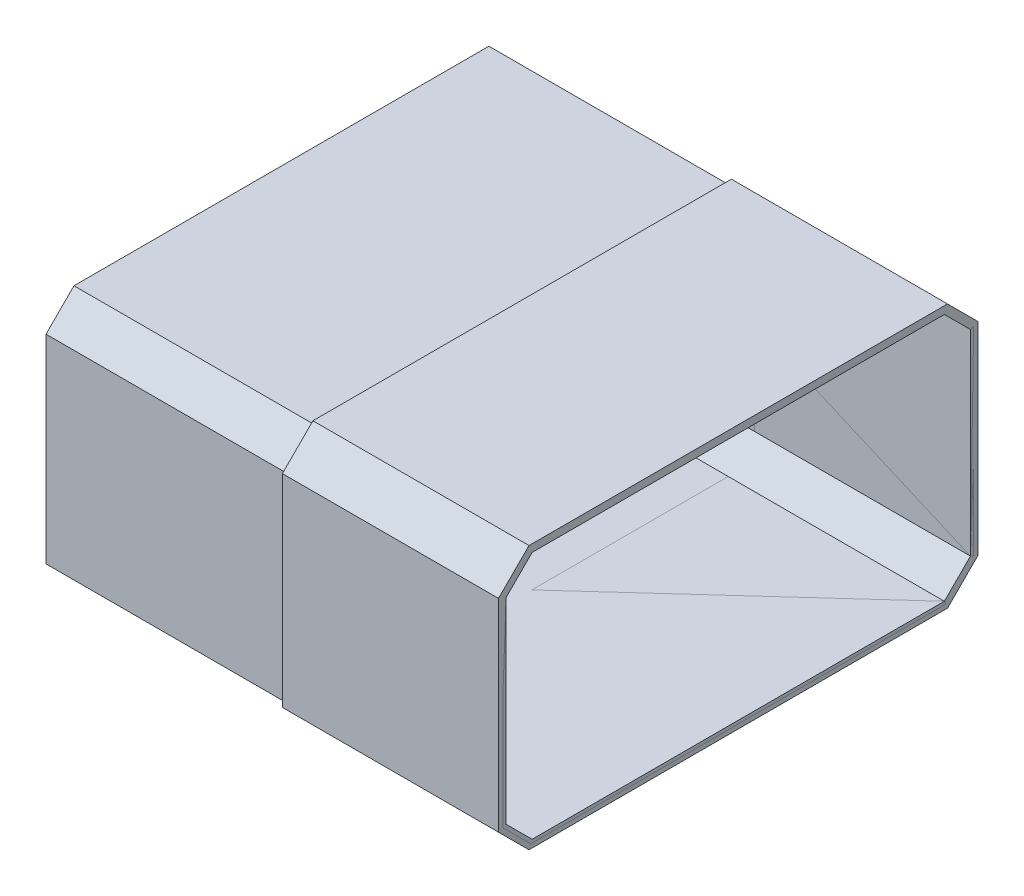
ISO-10303-21;
HEADER;
FILE_DESCRIPTION(('STEP AP214'),'2;1');
FILE_NAME('part.step','',(''),(''),'','','');
FILE_SCHEMA(('AUTOMOTIVE_DESIGN { 1 0 10303 214 1 1 1 1 }'));
ENDSEC;
DATA;
#1=APPLICATION_CONTEXT('core data for automotive mechanical design processes');
#2=APPLICATION_PROTOCOL_DEFINITION('international standard','automotive_design',2000,#1);
#3=PRODUCT_CONTEXT('',#1,'mechanical');
#4=PRODUCT('Part','Part','',(#3));
#5=PRODUCT_RELATED_PRODUCT_CATEGORY('part','',(#4));
#6=PRODUCT_DEFINITION_FORMATION('','',#4);
#7=PRODUCT_DEFINITION_CONTEXT('part definition',#1,'design');
#8=PRODUCT_DEFINITION('design','',#6,#7);
#9=PRODUCT_DEFINITION_SHAPE('','',#8);
#10=(LENGTH_UNIT() NAMED_UNIT(*) SI_UNIT(.MILLI.,.METRE.));
#11=(NAMED_UNIT(*) PLANE_ANGLE_UNIT() SI_UNIT($,.RADIAN.));
#12=(NAMED_UNIT(*) SI_UNIT($,.STERADIAN.) SOLID_ANGLE_UNIT());
#13=UNCERTAINTY_MEASURE_WITH_UNIT(LENGTH_MEASURE(1.E-05),#10,'distance_accuracy_value','');
#14=(GEOMETRIC_REPRESENTATION_CONTEXT(3) GLOBAL_UNCERTAINTY_ASSIGNED_CONTEXT((#13)) GLOBAL_UNIT_ASSIGNED_CONTEXT((#10,
#11,#12)) REPRESENTATION_CONTEXT('',''));
#15=CARTESIAN_POINT('',(0.,0.,0.));
#16=DIRECTION('',(0.,0.,1.));
#17=DIRECTION('',(1.,0.,0.));
#18=AXIS2_PLACEMENT_3D('',#15,#16,#17);
#19=CARTESIAN_POINT('',(190.275415021332,49.592810510066,-235.800889889658));
#20=DIRECTION('',(0.,1.,0.));
#21=DIRECTION('',(1.,0.,0.));
#22=AXIS2_PLACEMENT_3D('',#19,#20,#21);
#23=PLANE('',#22);
#24=DIRECTION('',(0.,0.,-1.));
#25=VECTOR('',#24,1.);
#26=CARTESIAN_POINT('',(395.275415021332,49.592810510066,-123.300889889658));
#27=LINE('',#26,#25);
#28=CARTESIAN_POINT('',(395.275415021332,49.592810510066,-44.943025513389));
#29=VERTEX_POINT('',#28);
#30=CARTESIAN_POINT('',(395.275415021332,49.592810510066,-426.658754265927));
#31=VERTEX_POINT('',#30);
#32=EDGE_CURVE('E259',#29,#31,#27,.T.);
#33=ORIENTED_EDGE('',*,*,#32,.T.);
#34=DIRECTION('',(1.,0.,0.));
#35=VECTOR('',#34,1.);
#36=CARTESIAN_POINT('',(77.775415021332,49.592810510066,-426.658754265927));
#37=LINE('',#36,#35);
#38=CARTESIAN_POINT('',(-24.724584978668,49.592810510066,-426.658754265927));
#39=VERTEX_POINT('',#38);
#40=EDGE_CURVE('E291',#39,#31,#37,.T.);
#41=ORIENTED_EDGE('',*,*,#40,.F.);
#42=DIRECTION('',(0.,0.,1.));
#43=VECTOR('',#42,1.);
#44=CARTESIAN_POINT('',(-24.724584978668,49.592810510066,-348.300889889658));
#45=LINE('',#44,#43);
#46=CARTESIAN_POINT('',(-24.724584978668,49.592810510066,-44.9430255133889));
#47=VERTEX_POINT('',#46);
#48=EDGE_CURVE('E12',#39,#47,#45,.T.);
#49=ORIENTED_EDGE('',*,*,#48,.T.);
#50=DIRECTION('',(-1.,0.,0.));
#51=VECTOR('',#50,1.);
#52=CARTESIAN_POINT('',(77.775415021332,49.592810510066,-44.9430255133889));
#53=LINE('',#52,#51);
#54=EDGE_CURVE('E347',#29,#47,#53,.T.);
#55=ORIENTED_EDGE('',*,*,#54,.F.);
#56=EDGE_LOOP('',(#33,#41,#49,#55));
#57=FACE_BOUND('',#56,.T.);
#58=ADVANCED_FACE('F48',(#57),#23,.T.);
#59=CARTESIAN_POINT('',(-24.724584978668,39.592810510066,-460.800889889658));
#60=DIRECTION('',(-1.,0.,0.));
#61=DIRECTION('',(0.,0.,1.));
#62=AXIS2_PLACEMENT_3D('',#59,#60,#61);
#63=PLANE('',#62);
#64=DIRECTION('',(0.,-0.707106781186548,0.707106781186548));
#65=VECTOR('',#64,1.);
#66=CARTESIAN_POINT('',(-24.724584978668,69.1638783219315,-446.229822077792));
#67=LINE('',#66,#65);
#68=CARTESIAN_POINT('',(-24.724584978668,73.7349461337969,-450.800889889658));
#69=VERTEX_POINT('',#68);
#70=EDGE_CURVE('E288',#69,#39,#67,.T.);
#71=ORIENTED_EDGE('',*,*,#70,.F.);
#72=DIRECTION('',(0.,1.,0.));
#73=VECTOR('',#72,1.);
#74=CARTESIAN_POINT('',(-24.724584978668,39.592810510066,-450.800889889658));
#75=LINE('',#74,#73);
#76=CARTESIAN_POINT('',(-24.724584978668,255.450674886335,-450.800889889658));
#77=VERTEX_POINT('',#76);
#78=EDGE_CURVE('E589',#69,#77,#75,.T.);
#79=ORIENTED_EDGE('',*,*,#78,.T.);
#80=DIRECTION('',(0.,-0.707106781186548,-0.707106781186548));
#81=VECTOR('',#80,1.);
#82=CARTESIAN_POINT('',(-24.724584978668,212.521742698201,-493.729822077792));
#83=LINE('',#82,#81);
#84=CARTESIAN_POINT('',(-24.724584978668,279.592810510066,-426.658754265927));
#85=VERTEX_POINT('',#84);
#86=EDGE_CURVE('E150',#85,#77,#83,.T.);
#87=ORIENTED_EDGE('',*,*,#86,.F.);
#88=DIRECTION('',(0.,0.,1.));
#89=VECTOR('',#88,1.);
#90=CARTESIAN_POINT('',(-24.724584978668,279.592810510066,-348.300889889658));
#91=LINE('',#90,#89);
#92=CARTESIAN_POINT('',(-24.724584978668,279.592810510066,-44.9430255133889));
#93=VERTEX_POINT('',#92);
#94=EDGE_CURVE('E264',#85,#93,#91,.T.);
#95=ORIENTED_EDGE('',*,*,#94,.T.);
#96=DIRECTION('',(0.,0.707106781186548,-0.707106781186548));
#97=VECTOR('',#96,1.);
#98=CARTESIAN_POINT('',(-24.724584978668,310.021742698201,-75.3719577015234));
#99=LINE('',#98,#97);
#100=CARTESIAN_POINT('',(-24.724584978668,255.450674886335,-20.800889889658));
#101=VERTEX_POINT('',#100);
#102=EDGE_CURVE('E273',#101,#93,#99,.T.);
#103=ORIENTED_EDGE('',*,*,#102,.F.);
#104=DIRECTION('',(0.,1.,0.));
#105=VECTOR('',#104,1.);
#106=CARTESIAN_POINT('',(-24.724584978668,39.592810510066,-20.800889889658));
#107=LINE('',#106,#105);
#108=CARTESIAN_POINT('',(-24.724584978668,73.7349461337969,-20.800889889658));
#109=VERTEX_POINT('',#108);
#110=EDGE_CURVE('E58',#109,#101,#107,.T.);
#111=ORIENTED_EDGE('',*,*,#110,.F.);
#112=DIRECTION('',(0.,0.707106781186548,0.707106781186548));
#113=VECTOR('',#112,1.);
#114=CARTESIAN_POINT('',(-24.724584978668,-58.3361216780685,-152.871957701523));
#115=LINE('',#114,#113);
#116=EDGE_CURVE('E344',#47,#109,#115,.T.);
#117=ORIENTED_EDGE('',*,*,#116,.F.);
#118=ORIENTED_EDGE('',*,*,#48,.F.);
#119=EDGE_LOOP('',(#71,#79,#87,#95,#103,#111,#117,#118));
#120=FACE_BOUND('',#119,.T.);
#121=ADVANCED_FACE('F386',(#120),#63,.F.);
#122=CARTESIAN_POINT('',(-34.724584978668,39.592810510066,-20.800889889658));
#123=DIRECTION('',(0.,0.,1.));
#124=DIRECTION('',(1.,0.,0.));
#125=AXIS2_PLACEMENT_3D('',#122,#123,#124);
#126=PLANE('',#125);
#127=DIRECTION('',(0.,-1.,0.));
#128=VECTOR('',#127,1.);
#129=CARTESIAN_POINT('',(395.275415021332,39.592810510066,-20.800889889658));
#130=LINE('',#129,#128);
#131=CARTESIAN_POINT('',(395.275415021332,255.450674886335,-20.800889889658));
#132=VERTEX_POINT('',#131);
#133=CARTESIAN_POINT('',(395.275415021332,73.734946133797,-20.800889889658));
#134=VERTEX_POINT('',#133);
#135=EDGE_CURVE('E337',#132,#134,#130,.T.);
#136=ORIENTED_EDGE('',*,*,#135,.T.);
#137=DIRECTION('',(1.,0.,0.));
#138=VECTOR('',#137,1.);
#139=CARTESIAN_POINT('',(-34.724584978668,73.734946133797,-20.800889889658));
#140=LINE('',#139,#138);
#141=EDGE_CURVE('E137',#109,#134,#140,.T.);
#142=ORIENTED_EDGE('',*,*,#141,.F.);
#143=ORIENTED_EDGE('',*,*,#110,.T.);
#144=DIRECTION('',(-1.,0.,0.));
#145=VECTOR('',#144,1.);
#146=CARTESIAN_POINT('',(-34.724584978668,255.450674886335,-20.800889889658));
#147=LINE('',#146,#145);
#148=EDGE_CURVE('E173',#132,#101,#147,.T.);
#149=ORIENTED_EDGE('',*,*,#148,.F.);
#150=EDGE_LOOP('',(#136,#142,#143,#149));
#151=FACE_BOUND('',#150,.T.);
#152=ADVANCED_FACE('F429',(#151),#126,.F.);
#153=CARTESIAN_POINT('',(-34.724584978668,46.6638783219315,-47.8719577015235));
#154=DIRECTION('',(0.,0.707106781186548,-0.707106781186548));
#155=DIRECTION('',(-1.,0.,0.));
#156=AXIS2_PLACEMENT_3D('',#153,#154,#155);
#157=PLANE('',#156);
#158=DIRECTION('',(0.,-0.707106781186548,-0.707106781186548));
#159=VECTOR('',#158,1.);
#160=CARTESIAN_POINT('',(395.275415021332,54.1638783219315,-40.3719577015235));
#161=LINE('',#160,#159);
#162=EDGE_CURVE('E263',#134,#29,#161,.T.);
#163=ORIENTED_EDGE('',*,*,#162,.T.);
#164=ORIENTED_EDGE('',*,*,#54,.T.);
#165=ORIENTED_EDGE('',*,*,#116,.T.);
#166=ORIENTED_EDGE('',*,*,#141,.T.);
#167=EDGE_LOOP('',(#163,#164,#165,#166));
#168=FACE_BOUND('',#167,.T.);
#169=ADVANCED_FACE('F451',(#168),#157,.T.);
#170=CARTESIAN_POINT('',(-34.724584978668,76.6638783219315,-453.729822077793));
#171=DIRECTION('',(0.,0.707106781186548,0.707106781186548));
#172=DIRECTION('',(1.,0.,0.));
#173=AXIS2_PLACEMENT_3D('',#170,#171,#172);
#174=PLANE('',#173);
#175=DIRECTION('',(0.,0.707106781186548,-0.707106781186548));
#176=VECTOR('',#175,1.);
#177=CARTESIAN_POINT('',(395.275415021332,-43.3361216780685,-333.729822077793));
#178=LINE('',#177,#176);
#179=CARTESIAN_POINT('',(395.275415021332,73.7349461337969,-450.800889889658));
#180=VERTEX_POINT('',#179);
#181=EDGE_CURVE('E257',#31,#180,#178,.T.);
#182=ORIENTED_EDGE('',*,*,#181,.T.);
#183=DIRECTION('',(-1.,0.,0.));
#184=VECTOR('',#183,1.);
#185=CARTESIAN_POINT('',(190.275415021332,73.734946133797,-450.800889889658));
#186=LINE('',#185,#184);
#187=EDGE_CURVE('E252',#180,#69,#186,.T.);
#188=ORIENTED_EDGE('',*,*,#187,.T.);
#189=ORIENTED_EDGE('',*,*,#70,.T.);
#190=ORIENTED_EDGE('',*,*,#40,.T.);
#191=EDGE_LOOP('',(#182,#188,#189,#190));
#192=FACE_BOUND('',#191,.T.);
#193=ADVANCED_FACE('F50',(#192),#174,.T.);
#194=CARTESIAN_POINT('',(-27.724584978668,39.592810510066,-460.800889889658));
#195=DIRECTION('',(-1.,0.,0.));
#196=DIRECTION('',(0.,0.,1.));
#197=AXIS2_PLACEMENT_3D('',#194,#195,#196);
#198=PLANE('',#197);
#199=DIRECTION('',(0.,-0.707106781186548,0.707106781186548));
#200=VECTOR('',#199,1.);
#201=CARTESIAN_POINT('',(-27.724584978668,67.0425579783718,-448.351142421352));
#202=LINE('',#201,#200);
#203=CARTESIAN_POINT('',(-27.724584978668,72.4923054466776,-453.800889889658));
#204=VERTEX_POINT('',#203);
#205=CARTESIAN_POINT('',(-27.724584978668,46.592810510066,-427.901394953046));
#206=VERTEX_POINT('',#205);
#207=EDGE_CURVE('E227',#204,#206,#202,.T.);
#208=ORIENTED_EDGE('',*,*,#207,.T.);
#209=DIRECTION('',(0.,0.,1.));
#210=VECTOR('',#209,1.);
#211=CARTESIAN_POINT('',(-27.724584978668,46.592810510066,-348.300889889658));
#212=LINE('',#211,#210);
#213=CARTESIAN_POINT('',(-27.724584978668,46.592810510066,-43.7003848262697));
#214=VERTEX_POINT('',#213);
#215=EDGE_CURVE('E272',#206,#214,#212,.T.);
#216=ORIENTED_EDGE('',*,*,#215,.T.);
#217=DIRECTION('',(0.,0.707106781186548,0.707106781186548));
#218=VECTOR('',#217,1.);
#219=CARTESIAN_POINT('',(-27.724584978668,-60.457442021628,-150.750637357964));
#220=LINE('',#219,#218);
#221=CARTESIAN_POINT('',(-27.724584978668,72.4923054466777,-17.800889889658));
#222=VERTEX_POINT('',#221);
#223=EDGE_CURVE('E233',#214,#222,#220,.T.);
#224=ORIENTED_EDGE('',*,*,#223,.T.);
#225=DIRECTION('',(0.,1.,0.));
#226=VECTOR('',#225,1.);
#227=CARTESIAN_POINT('',(-27.724584978668,39.592810510066,-17.800889889658));
#228=LINE('',#227,#226);
#229=CARTESIAN_POINT('',(-27.724584978668,256.693315573454,-17.800889889658));
#230=VERTEX_POINT('',#229);
#231=EDGE_CURVE('E230',#222,#230,#228,.T.);
#232=ORIENTED_EDGE('',*,*,#231,.T.);
#233=DIRECTION('',(0.,0.707106781186548,-0.707106781186548));
#234=VECTOR('',#233,1.);
#235=CARTESIAN_POINT('',(-27.724584978668,312.14306304176,-73.2506373579638));
#236=LINE('',#235,#234);
#237=CARTESIAN_POINT('',(-27.724584978668,282.592810510066,-43.7003848262697));
#238=VERTEX_POINT('',#237);
#239=EDGE_CURVE('E217',#230,#238,#236,.T.);
#240=ORIENTED_EDGE('',*,*,#239,.T.);
#241=DIRECTION('',(0.,0.,1.));
#242=VECTOR('',#241,1.);
#243=CARTESIAN_POINT('',(-27.724584978668,282.592810510066,-348.300889889658));
#244=LINE('',#243,#242);
#245=CARTESIAN_POINT('',(-27.724584978668,282.592810510066,-427.901394953046));
#246=VERTEX_POINT('',#245);
#247=EDGE_CURVE('E292',#246,#238,#244,.T.);
#248=ORIENTED_EDGE('',*,*,#247,.F.);
#249=DIRECTION('',(0.,-0.707106781186548,-0.707106781186548));
#250=VECTOR('',#249,1.);
#251=CARTESIAN_POINT('',(-27.724584978668,214.64306304176,-495.851142421352));
#252=LINE('',#251,#250);
#253=CARTESIAN_POINT('',(-27.724584978668,256.693315573454,-453.800889889658));
#254=VERTEX_POINT('',#253);
#255=EDGE_CURVE('E304',#246,#254,#252,.T.);
#256=ORIENTED_EDGE('',*,*,#255,.T.);
#257=DIRECTION('',(0.,1.,0.));
#258=VECTOR('',#257,1.);
#259=CARTESIAN_POINT('',(-27.724584978668,39.592810510066,-453.800889889658));
#260=LINE('',#259,#258);
#261=EDGE_CURVE('E294',#204,#254,#260,.T.);
#262=ORIENTED_EDGE('',*,*,#261,.F.);
#263=EDGE_LOOP('',(#208,#216,#224,#232,#240,#248,#256,#262));
#264=FACE_BOUND('',#263,.T.);
#265=ADVANCED_FACE('F231',(#264),#198,.T.);
#266=CARTESIAN_POINT('',(190.275415021332,282.592810510066,-235.800889889658));
#267=DIRECTION('',(0.,1.,0.));
#268=DIRECTION('',(1.,0.,0.));
#269=AXIS2_PLACEMENT_3D('',#266,#267,#268);
#270=PLANE('',#269);
#271=DIRECTION('',(0.,0.,-1.));
#272=VECTOR('',#271,1.);
#273=CARTESIAN_POINT('',(395.275415021332,282.592810510066,-123.300889889658));
#274=LINE('',#273,#272);
#275=CARTESIAN_POINT('',(395.275415021332,282.592810510066,-43.7003848262697));
#276=VERTEX_POINT('',#275);
#277=CARTESIAN_POINT('',(395.275415021332,282.592810510066,-427.901394953046));
#278=VERTEX_POINT('',#277);
#279=EDGE_CURVE('E284',#276,#278,#274,.T.);
#280=ORIENTED_EDGE('',*,*,#279,.T.);
#281=DIRECTION('',(-1.,0.,0.));
#282=VECTOR('',#281,1.);
#283=CARTESIAN_POINT('',(77.775415021332,282.592810510066,-427.901394953046));
#284=LINE('',#283,#282);
#285=EDGE_CURVE('E297',#278,#246,#284,.T.);
#286=ORIENTED_EDGE('',*,*,#285,.T.);
#287=ORIENTED_EDGE('',*,*,#247,.T.);
#288=DIRECTION('',(1.,0.,0.));
#289=VECTOR('',#288,1.);
#290=CARTESIAN_POINT('',(77.775415021332,282.592810510066,-43.7003848262697));
#291=LINE('',#290,#289);
#292=EDGE_CURVE('E224',#238,#276,#291,.T.);
#293=ORIENTED_EDGE('',*,*,#292,.T.);
#294=EDGE_LOOP('',(#280,#286,#287,#293));
#295=FACE_BOUND('',#294,.T.);
#296=ADVANCED_FACE('F446',(#295),#270,.T.);
#297=CARTESIAN_POINT('',(415.275415021332,39.592810510066,-453.800889889658));
#298=DIRECTION('',(0.,0.,-1.));
#299=DIRECTION('',(0.,-1.,0.));
#300=AXIS2_PLACEMENT_3D('',#297,#298,#299);
#301=PLANE('',#300);
#302=DIRECTION('',(0.,-1.,0.));
#303=VECTOR('',#302,1.);
#304=CARTESIAN_POINT('',(395.275415021332,39.592810510066,-453.800889889658));
#305=LINE('',#304,#303);
#306=CARTESIAN_POINT('',(395.275415021332,256.693315573454,-453.800889889658));
#307=VERTEX_POINT('',#306);
#308=CARTESIAN_POINT('',(395.275415021332,72.4923054466776,-453.800889889658));
#309=VERTEX_POINT('',#308);
#310=EDGE_CURVE('E285',#307,#309,#305,.T.);
#311=ORIENTED_EDGE('',*,*,#310,.T.);
#312=DIRECTION('',(-1.,0.,0.));
#313=VECTOR('',#312,1.);
#314=CARTESIAN_POINT('',(190.275415021332,72.4923054466776,-453.800889889658));
#315=LINE('',#314,#313);
#316=EDGE_CURVE('E300',#309,#204,#315,.T.);
#317=ORIENTED_EDGE('',*,*,#316,.T.);
#318=ORIENTED_EDGE('',*,*,#261,.T.);
#319=DIRECTION('',(1.,0.,0.));
#320=VECTOR('',#319,1.);
#321=CARTESIAN_POINT('',(190.275415021332,256.693315573454,-453.800889889658));
#322=LINE('',#321,#320);
#323=EDGE_CURVE('E316',#254,#307,#322,.T.);
#324=ORIENTED_EDGE('',*,*,#323,.T.);
#325=EDGE_LOOP('',(#311,#317,#318,#324));
#326=FACE_BOUND('',#325,.T.);
#327=ADVANCED_FACE('F413',(#326),#301,.T.);
#328=CARTESIAN_POINT('',(-34.724584978668,284.64306304176,-425.851142421352));
#329=DIRECTION('',(0.,-0.707106781186548,0.707106781186548));
#330=DIRECTION('',(-1.,0.,0.));
#331=AXIS2_PLACEMENT_3D('',#328,#329,#330);
#332=PLANE('',#331);
#333=DIRECTION('',(0.,-0.707106781186548,-0.707106781186548));
#334=VECTOR('',#333,1.);
#335=CARTESIAN_POINT('',(395.275415021332,327.14306304176,-383.351142421352));
#336=LINE('',#335,#334);
#337=EDGE_CURVE('E280',#278,#307,#336,.T.);
#338=ORIENTED_EDGE('',*,*,#337,.T.);
#339=ORIENTED_EDGE('',*,*,#323,.F.);
#340=ORIENTED_EDGE('',*,*,#255,.F.);
#341=ORIENTED_EDGE('',*,*,#285,.F.);
#342=EDGE_LOOP('',(#338,#339,#340,#341));
#343=FACE_BOUND('',#342,.T.);
#344=ADVANCED_FACE('F408',(#343),#332,.F.);
#345=CARTESIAN_POINT('',(-34.724584978668,74.5425579783718,-455.851142421352));
#346=DIRECTION('',(0.,0.707106781186548,0.707106781186548));
#347=DIRECTION('',(1.,0.,0.));
#348=AXIS2_PLACEMENT_3D('',#345,#346,#347);
#349=PLANE('',#348);
#350=DIRECTION('',(0.,-0.707106781186548,0.707106781186548));
#351=VECTOR('',#350,1.);
#352=CARTESIAN_POINT('',(395.275415021332,-45.4574420216282,-335.851142421352));
#353=LINE('',#352,#351);
#354=CARTESIAN_POINT('',(395.275415021332,46.592810510066,-427.901394953046));
#355=VERTEX_POINT('',#354);
#356=EDGE_CURVE('E308',#309,#355,#353,.T.);
#357=ORIENTED_EDGE('',*,*,#356,.T.);
#358=DIRECTION('',(1.,0.,0.));
#359=VECTOR('',#358,1.);
#360=CARTESIAN_POINT('',(77.775415021332,46.592810510066,-427.901394953046));
#361=LINE('',#360,#359);
#362=EDGE_CURVE('E276',#206,#355,#361,.T.);
#363=ORIENTED_EDGE('',*,*,#362,.F.);
#364=ORIENTED_EDGE('',*,*,#207,.F.);
#365=ORIENTED_EDGE('',*,*,#316,.F.);
#366=EDGE_LOOP('',(#357,#363,#364,#365));
#367=FACE_BOUND('',#366,.T.);
#368=ADVANCED_FACE('F412',(#367),#349,.F.);
#369=CARTESIAN_POINT('',(-34.724584978668,254.64306304176,-15.7506373579638));
#370=DIRECTION('',(0.,-0.707106781186548,-0.707106781186548));
#371=DIRECTION('',(0.,-0.707106781186548,0.707106781186548));
#372=AXIS2_PLACEMENT_3D('',#369,#370,#371);
#373=PLANE('',#372);
#374=DIRECTION('',(0.,0.707106781186548,-0.707106781186548));
#375=VECTOR('',#374,1.);
#376=CARTESIAN_POINT('',(395.275415021332,199.64306304176,39.2493626420362));
#377=LINE('',#376,#375);
#378=CARTESIAN_POINT('',(395.275415021332,256.693315573454,-17.800889889658));
#379=VERTEX_POINT('',#378);
#380=EDGE_CURVE('E277',#379,#276,#377,.T.);
#381=ORIENTED_EDGE('',*,*,#380,.T.);
#382=ORIENTED_EDGE('',*,*,#292,.F.);
#383=ORIENTED_EDGE('',*,*,#239,.F.);
#384=DIRECTION('',(-1.,0.,0.));
#385=VECTOR('',#384,1.);
#386=CARTESIAN_POINT('',(-34.724584978668,256.693315573454,-17.800889889658));
#387=LINE('',#386,#385);
#388=EDGE_CURVE('E222',#379,#230,#387,.T.);
#389=ORIENTED_EDGE('',*,*,#388,.F.);
#390=EDGE_LOOP('',(#381,#382,#383,#389));
#391=FACE_BOUND('',#390,.T.);
#392=ADVANCED_FACE('F220',(#391),#373,.F.);
#393=CARTESIAN_POINT('',(-34.724584978668,39.592810510066,-17.800889889658));
#394=DIRECTION('',(0.,0.,1.));
#395=DIRECTION('',(1.,0.,0.));
#396=AXIS2_PLACEMENT_3D('',#393,#394,#395);
#397=PLANE('',#396);
#398=DIRECTION('',(0.,1.,0.));
#399=VECTOR('',#398,1.);
#400=CARTESIAN_POINT('',(395.275415021332,39.592810510066,-17.800889889658));
#401=LINE('',#400,#399);
#402=CARTESIAN_POINT('',(395.275415021332,72.4923054466777,-17.800889889658));
#403=VERTEX_POINT('',#402);
#404=EDGE_CURVE('E240',#403,#379,#401,.T.);
#405=ORIENTED_EDGE('',*,*,#404,.T.);
#406=ORIENTED_EDGE('',*,*,#388,.T.);
#407=ORIENTED_EDGE('',*,*,#231,.F.);
#408=DIRECTION('',(1.,0.,0.));
#409=VECTOR('',#408,1.);
#410=CARTESIAN_POINT('',(-34.724584978668,72.4923054466777,-17.800889889658));
#411=LINE('',#410,#409);
#412=EDGE_CURVE('E248',#222,#403,#411,.T.);
#413=ORIENTED_EDGE('',*,*,#412,.T.);
#414=EDGE_LOOP('',(#405,#406,#407,#413));
#415=FACE_BOUND('',#414,.T.);
#416=ADVANCED_FACE('F238',(#415),#397,.T.);
#417=CARTESIAN_POINT('',(-34.724584978668,44.5425579783718,-45.7506373579638));
#418=DIRECTION('',(0.,0.707106781186548,-0.707106781186548));
#419=DIRECTION('',(-1.,0.,0.));
#420=AXIS2_PLACEMENT_3D('',#417,#418,#419);
#421=PLANE('',#420);
#422=DIRECTION('',(0.,0.707106781186548,0.707106781186548));
#423=VECTOR('',#422,1.);
#424=CARTESIAN_POINT('',(395.275415021332,52.0425579783718,-38.2506373579638));
#425=LINE('',#424,#423);
#426=CARTESIAN_POINT('',(395.275415021332,46.592810510066,-43.7003848262697));
#427=VERTEX_POINT('',#426);
#428=EDGE_CURVE('E329',#427,#403,#425,.T.);
#429=ORIENTED_EDGE('',*,*,#428,.T.);
#430=ORIENTED_EDGE('',*,*,#412,.F.);
#431=ORIENTED_EDGE('',*,*,#223,.F.);
#432=DIRECTION('',(-1.,0.,0.));
#433=VECTOR('',#432,1.);
#434=CARTESIAN_POINT('',(77.775415021332,46.592810510066,-43.7003848262697));
#435=LINE('',#434,#433);
#436=EDGE_CURVE('E268',#427,#214,#435,.T.);
#437=ORIENTED_EDGE('',*,*,#436,.F.);
#438=EDGE_LOOP('',(#429,#430,#431,#437));
#439=FACE_BOUND('',#438,.T.);
#440=ADVANCED_FACE('F403',(#439),#421,.F.);
#441=CARTESIAN_POINT('',(190.275415021332,46.592810510066,-235.800889889658));
#442=DIRECTION('',(0.,1.,0.));
#443=DIRECTION('',(1.,0.,0.));
#444=AXIS2_PLACEMENT_3D('',#441,#442,#443);
#445=PLANE('',#444);
#446=DIRECTION('',(0.,0.,1.));
#447=VECTOR('',#446,1.);
#448=CARTESIAN_POINT('',(395.275415021332,46.592810510066,-123.300889889658));
#449=LINE('',#448,#447);
#450=EDGE_CURVE('E336',#355,#427,#449,.T.);
#451=ORIENTED_EDGE('',*,*,#450,.T.);
#452=ORIENTED_EDGE('',*,*,#436,.T.);
#453=ORIENTED_EDGE('',*,*,#215,.F.);
#454=ORIENTED_EDGE('',*,*,#362,.T.);
#455=EDGE_LOOP('',(#451,#452,#453,#454));
#456=FACE_BOUND('',#455,.T.);
#457=ADVANCED_FACE('F370',(#456),#445,.F.);
#458=CARTESIAN_POINT('',(-34.724584978668,252.521742698201,-17.8719577015235));
#459=DIRECTION('',(0.,-0.707106781186548,-0.707106781186548));
#460=DIRECTION('',(0.,-0.707106781186548,0.707106781186548));
#461=AXIS2_PLACEMENT_3D('',#458,#459,#460);
#462=PLANE('',#461);
#463=DIRECTION('',(0.,-0.707106781186548,0.707106781186548));
#464=VECTOR('',#463,1.);
#465=CARTESIAN_POINT('',(395.275415021332,197.521742698201,37.1280422984765));
#466=LINE('',#465,#464);
#467=CARTESIAN_POINT('',(395.275415021332,279.592810510066,-44.9430255133889));
#468=VERTEX_POINT('',#467);
#469=EDGE_CURVE('E312',#468,#132,#466,.T.);
#470=ORIENTED_EDGE('',*,*,#469,.T.);
#471=ORIENTED_EDGE('',*,*,#148,.T.);
#472=ORIENTED_EDGE('',*,*,#102,.T.);
#473=DIRECTION('',(1.,0.,0.));
#474=VECTOR('',#473,1.);
#475=CARTESIAN_POINT('',(77.775415021332,279.592810510066,-44.9430255133889));
#476=LINE('',#475,#474);
#477=EDGE_CURVE('E184',#93,#468,#476,.T.);
#478=ORIENTED_EDGE('',*,*,#477,.T.);
#479=EDGE_LOOP('',(#470,#471,#472,#478));
#480=FACE_BOUND('',#479,.T.);
#481=ADVANCED_FACE('F364',(#480),#462,.T.);
#482=CARTESIAN_POINT('',(190.275415021332,279.592810510066,-235.800889889658));
#483=DIRECTION('',(0.,1.,0.));
#484=DIRECTION('',(1.,0.,0.));
#485=AXIS2_PLACEMENT_3D('',#482,#483,#484);
#486=PLANE('',#485);
#487=DIRECTION('',(0.,0.,1.));
#488=VECTOR('',#487,1.);
#489=CARTESIAN_POINT('',(395.275415021332,279.592810510066,-123.300889889658));
#490=LINE('',#489,#488);
#491=CARTESIAN_POINT('',(395.275415021332,279.592810510066,-426.658754265927));
#492=VERTEX_POINT('',#491);
#493=EDGE_CURVE('E357',#492,#468,#490,.T.);
#494=ORIENTED_EDGE('',*,*,#493,.T.);
#495=ORIENTED_EDGE('',*,*,#477,.F.);
#496=ORIENTED_EDGE('',*,*,#94,.F.);
#497=DIRECTION('',(-1.,0.,0.));
#498=VECTOR('',#497,1.);
#499=CARTESIAN_POINT('',(77.775415021332,279.592810510066,-426.658754265927));
#500=LINE('',#499,#498);
#501=EDGE_CURVE('E166',#492,#85,#500,.T.);
#502=ORIENTED_EDGE('',*,*,#501,.F.);
#503=EDGE_LOOP('',(#494,#495,#496,#502));
#504=FACE_BOUND('',#503,.T.);
#505=ADVANCED_FACE('F369',(#504),#486,.F.);
#506=CARTESIAN_POINT('',(-34.724584978668,282.521742698201,-423.729822077793));
#507=DIRECTION('',(0.,-0.707106781186548,0.707106781186548));
#508=DIRECTION('',(-1.,0.,0.));
#509=AXIS2_PLACEMENT_3D('',#506,#507,#508);
#510=PLANE('',#509);
#511=DIRECTION('',(0.,0.707106781186548,0.707106781186548));
#512=VECTOR('',#511,1.);
#513=CARTESIAN_POINT('',(395.275415021332,325.021742698201,-381.229822077792));
#514=LINE('',#513,#512);
#515=CARTESIAN_POINT('',(395.275415021332,255.450674886335,-450.800889889658));
#516=VERTEX_POINT('',#515);
#517=EDGE_CURVE('E258',#516,#492,#514,.T.);
#518=ORIENTED_EDGE('',*,*,#517,.T.);
#519=ORIENTED_EDGE('',*,*,#501,.T.);
#520=ORIENTED_EDGE('',*,*,#86,.T.);
#521=DIRECTION('',(1.,0.,0.));
#522=VECTOR('',#521,1.);
#523=CARTESIAN_POINT('',(190.275415021332,255.450674886335,-450.800889889658));
#524=LINE('',#523,#522);
#525=EDGE_CURVE('E340',#77,#516,#524,.T.);
#526=ORIENTED_EDGE('',*,*,#525,.T.);
#527=EDGE_LOOP('',(#518,#519,#520,#526));
#528=FACE_BOUND('',#527,.T.);
#529=ADVANCED_FACE('F378',(#528),#510,.T.);
#530=CARTESIAN_POINT('',(415.275415021332,39.592810510066,-450.800889889658));
#531=DIRECTION('',(0.,0.,-1.));
#532=DIRECTION('',(0.,-1.,0.));
#533=AXIS2_PLACEMENT_3D('',#530,#531,#532);
#534=PLANE('',#533);
#535=DIRECTION('',(0.,1.,0.));
#536=VECTOR('',#535,1.);
#537=CARTESIAN_POINT('',(395.275415021332,39.592810510066,-450.800889889658));
#538=LINE('',#537,#536);
#539=EDGE_CURVE('E254',#180,#516,#538,.T.);
#540=ORIENTED_EDGE('',*,*,#539,.T.);
#541=ORIENTED_EDGE('',*,*,#525,.F.);
#542=ORIENTED_EDGE('',*,*,#78,.F.);
#543=ORIENTED_EDGE('',*,*,#187,.F.);
#544=EDGE_LOOP('',(#540,#541,#542,#543));
#545=FACE_BOUND('',#544,.T.);
#546=ADVANCED_FACE('F395',(#545),#534,.F.);
#547=CARTESIAN_POINT('',(395.275415021332,39.592810510066,-10.800889889658));
#548=DIRECTION('',(-1.,0.,0.));
#549=DIRECTION('',(0.,0.,1.));
#550=AXIS2_PLACEMENT_3D('',#547,#548,#549);
#551=PLANE('',#550);
#552=ORIENTED_EDGE('',*,*,#469,.F.);
#553=ORIENTED_EDGE('',*,*,#493,.F.);
#554=ORIENTED_EDGE('',*,*,#517,.F.);
#555=ORIENTED_EDGE('',*,*,#539,.F.);
#556=ORIENTED_EDGE('',*,*,#181,.F.);
#557=ORIENTED_EDGE('',*,*,#32,.F.);
#558=ORIENTED_EDGE('',*,*,#162,.F.);
#559=ORIENTED_EDGE('',*,*,#135,.F.);
#560=EDGE_LOOP('',(#552,#553,#554,#555,#556,#557,#558,#559));
#561=FACE_BOUND('',#560,.T.);
#562=ORIENTED_EDGE('',*,*,#380,.F.);
#563=ORIENTED_EDGE('',*,*,#404,.F.);
#564=ORIENTED_EDGE('',*,*,#428,.F.);
#565=ORIENTED_EDGE('',*,*,#450,.F.);
#566=ORIENTED_EDGE('',*,*,#356,.F.);
#567=ORIENTED_EDGE('',*,*,#310,.F.);
#568=ORIENTED_EDGE('',*,*,#337,.F.);
#569=ORIENTED_EDGE('',*,*,#279,.F.);
#570=EDGE_LOOP('',(#562,#563,#564,#565,#566,#567,#568,#569));
#571=FACE_BOUND('',#570,.T.);
#572=ADVANCED_FACE('F437',(#561,#571),#551,.F.);
#573=CLOSED_SHELL('',(#58,#121,#152,#169,#193,#265,#296,#327,#344,#368,#392,#416,#440,#457,#481,
#505,#529,#546,#572));
#574=MANIFOLD_SOLID_BREP('B2',#573);
#575=CARTESIAN_POINT('',(395.275415021333,279.592810510066,-426.658754265927));
#576=DIRECTION('',(0.,-1.,0.));
#577=DIRECTION('',(-1.,0.,0.));
#578=AXIS2_PLACEMENT_3D('',#575,#576,#577);
#579=PLANE('',#578);
#580=DIRECTION('',(0.,0.,1.));
#581=VECTOR('',#580,1.);
#582=CARTESIAN_POINT('',(395.275415021333,279.592810510066,-44.9430255133889));
#583=LINE('',#582,#581);
#584=CARTESIAN_POINT('',(395.275415021333,279.592810510066,-426.658754265927));
#585=VERTEX_POINT('',#584);
#586=CARTESIAN_POINT('',(395.275415021333,279.592810510066,-44.9430255133889));
#587=VERTEX_POINT('',#586);
#588=EDGE_CURVE('E913',#585,#587,#583,.T.);
#589=ORIENTED_EDGE('',*,*,#588,.T.);
#590=DIRECTION('',(-1.,0.,0.));
#591=VECTOR('',#590,1.);
#592=CARTESIAN_POINT('',(395.275415021333,279.592810510066,-44.9430255133889));
#593=LINE('',#592,#591);
#594=CARTESIAN_POINT('',(195.175415021333,279.592810510066,-44.9430255133889));
#595=VERTEX_POINT('',#594);
#596=EDGE_CURVE('E46',#587,#595,#593,.T.);
#597=ORIENTED_EDGE('',*,*,#596,.T.);
#598=DIRECTION('',(0.,0.,1.));
#599=VECTOR('',#598,1.);
#600=CARTESIAN_POINT('',(195.175415021333,279.592810510066,-44.9430255133889));
#601=LINE('',#600,#599);
#602=CARTESIAN_POINT('',(195.175415021333,279.592810510066,-426.658754265927));
#603=VERTEX_POINT('',#602);
#604=EDGE_CURVE('E963',#603,#595,#601,.T.);
#605=ORIENTED_EDGE('',*,*,#604,.F.);
#606=DIRECTION('',(-1.,0.,0.));
#607=VECTOR('',#606,1.);
#608=CARTESIAN_POINT('',(395.275415021333,279.592810510066,-426.658754265927));
#609=LINE('',#608,#607);
#610=EDGE_CURVE('E934',#585,#603,#609,.T.);
#611=ORIENTED_EDGE('',*,*,#610,.F.);
#612=EDGE_LOOP('',(#589,#597,#605,#611));
#613=FACE_BOUND('',#612,.T.);
#614=ADVANCED_FACE('F707',(#613),#579,.T.);
#615=CARTESIAN_POINT('',(395.275415021333,279.592810510066,-44.9430255133889));
#616=DIRECTION('',(0.,-0.707106781186547,-0.707106781186548));
#617=DIRECTION('',(-1.,0.,0.));
#618=AXIS2_PLACEMENT_3D('',#615,#616,#617);
#619=PLANE('',#618);
#620=DIRECTION('',(0.,-0.707106781186548,0.707106781186547));
#621=VECTOR('',#620,1.);
#622=CARTESIAN_POINT('',(395.275415021333,279.592810510066,-44.9430255133889));
#623=LINE('',#622,#621);
#624=CARTESIAN_POINT('',(395.275415021333,255.450674886335,-20.800889889658));
#625=VERTEX_POINT('',#624);
#626=EDGE_CURVE('E920',#587,#625,#623,.T.);
#627=ORIENTED_EDGE('',*,*,#626,.T.);
#628=DIRECTION('',(-1.,0.,0.));
#629=VECTOR('',#628,1.);
#630=CARTESIAN_POINT('',(395.275415021333,255.450674886335,-20.800889889658));
#631=LINE('',#630,#629);
#632=CARTESIAN_POINT('',(195.175415021333,255.450674886335,-20.800889889658));
#633=VERTEX_POINT('',#632);
#634=EDGE_CURVE('E717',#625,#633,#631,.T.);
#635=ORIENTED_EDGE('',*,*,#634,.T.);
#636=DIRECTION('',(0.,-0.707106781186548,0.707106781186547));
#637=VECTOR('',#636,1.);
#638=CARTESIAN_POINT('',(195.175415021333,279.592810510066,-44.9430255133889));
#639=LINE('',#638,#637);
#640=EDGE_CURVE('E869',#595,#633,#639,.T.);
#641=ORIENTED_EDGE('',*,*,#640,.F.);
#642=ORIENTED_EDGE('',*,*,#596,.F.);
#643=EDGE_LOOP('',(#627,#635,#641,#642));
#644=FACE_BOUND('',#643,.T.);
#645=ADVANCED_FACE('F1072',(#644),#619,.T.);
#646=CARTESIAN_POINT('',(395.275415021333,255.450674886335,-20.800889889658));
#647=DIRECTION('',(0.,0.,-1.));
#648=DIRECTION('',(0.,1.,0.));
#649=AXIS2_PLACEMENT_3D('',#646,#647,#648);
#650=PLANE('',#649);
#651=DIRECTION('',(0.,-1.,0.));
#652=VECTOR('',#651,1.);
#653=CARTESIAN_POINT('',(395.275415021333,73.734946133797,-20.800889889658));
#654=LINE('',#653,#652);
#655=CARTESIAN_POINT('',(395.275415021333,73.734946133797,-20.800889889658));
#656=VERTEX_POINT('',#655);
#657=EDGE_CURVE('E944',#625,#656,#654,.T.);
#658=ORIENTED_EDGE('',*,*,#657,.T.);
#659=DIRECTION('',(-1.,0.,0.));
#660=VECTOR('',#659,1.);
#661=CARTESIAN_POINT('',(395.275415021333,73.734946133797,-20.800889889658));
#662=LINE('',#661,#660);
#663=CARTESIAN_POINT('',(195.175415021333,73.734946133797,-20.800889889658));
#664=VERTEX_POINT('',#663);
#665=EDGE_CURVE('E845',#656,#664,#662,.T.);
#666=ORIENTED_EDGE('',*,*,#665,.T.);
#667=DIRECTION('',(0.,-1.,0.));
#668=VECTOR('',#667,1.);
#669=CARTESIAN_POINT('',(195.175415021333,73.734946133797,-20.800889889658));
#670=LINE('',#669,#668);
#671=EDGE_CURVE('E862',#633,#664,#670,.T.);
#672=ORIENTED_EDGE('',*,*,#671,.F.);
#673=ORIENTED_EDGE('',*,*,#634,.F.);
#674=EDGE_LOOP('',(#658,#666,#672,#673));
#675=FACE_BOUND('',#674,.T.);
#676=ADVANCED_FACE('F1077',(#675),#650,.T.);
#677=CARTESIAN_POINT('',(395.275415021333,73.734946133797,-20.800889889658));
#678=DIRECTION('',(0.,0.707106781186548,-0.707106781186548));
#679=DIRECTION('',(-1.,0.,0.));
#680=AXIS2_PLACEMENT_3D('',#677,#678,#679);
#681=PLANE('',#680);
#682=DIRECTION('',(0.,-0.707106781186548,-0.707106781186548));
#683=VECTOR('',#682,1.);
#684=CARTESIAN_POINT('',(395.275415021333,73.734946133797,-20.800889889658));
#685=LINE('',#684,#683);
#686=CARTESIAN_POINT('',(395.275415021333,49.592810510066,-44.943025513389));
#687=VERTEX_POINT('',#686);
#688=EDGE_CURVE('E840',#656,#687,#685,.T.);
#689=ORIENTED_EDGE('',*,*,#688,.T.);
#690=DIRECTION('',(-1.,0.,0.));
#691=VECTOR('',#690,1.);
#692=CARTESIAN_POINT('',(395.275415021333,49.592810510066,-44.943025513389));
#693=LINE('',#692,#691);
#694=CARTESIAN_POINT('',(195.175415021333,49.592810510066,-44.9430255133889));
#695=VERTEX_POINT('',#694);
#696=EDGE_CURVE('E833',#687,#695,#693,.T.);
#697=ORIENTED_EDGE('',*,*,#696,.T.);
#698=DIRECTION('',(0.,-0.707106781186548,-0.707106781186548));
#699=VECTOR('',#698,1.);
#700=CARTESIAN_POINT('',(195.175415021333,73.734946133797,-20.800889889658));
#701=LINE('',#700,#699);
#702=EDGE_CURVE('E837',#664,#695,#701,.T.);
#703=ORIENTED_EDGE('',*,*,#702,.F.);
#704=ORIENTED_EDGE('',*,*,#665,.F.);
#705=EDGE_LOOP('',(#689,#697,#703,#704));
#706=FACE_BOUND('',#705,.T.);
#707=ADVANCED_FACE('F835',(#706),#681,.T.);
#708=CARTESIAN_POINT('',(395.275415021333,49.592810510066,-44.9430255133889));
#709=DIRECTION('',(0.,1.,0.));
#710=DIRECTION('',(0.,0.,-1.));
#711=AXIS2_PLACEMENT_3D('',#708,#709,#710);
#712=PLANE('',#711);
#713=DIRECTION('',(0.,0.,-1.));
#714=VECTOR('',#713,1.);
#715=CARTESIAN_POINT('',(395.275415021333,49.592810510066,-426.658754265927));
#716=LINE('',#715,#714);
#717=CARTESIAN_POINT('',(395.275415021333,49.592810510066,-426.658754265927));
#718=VERTEX_POINT('',#717);
#719=EDGE_CURVE('E891',#687,#718,#716,.T.);
#720=ORIENTED_EDGE('',*,*,#719,.T.);
#721=DIRECTION('',(-1.,0.,0.));
#722=VECTOR('',#721,1.);
#723=CARTESIAN_POINT('',(395.275415021333,49.592810510066,-426.658754265927));
#724=LINE('',#723,#722);
#725=CARTESIAN_POINT('',(195.175415021333,49.592810510066,-426.658754265927));
#726=VERTEX_POINT('',#725);
#727=EDGE_CURVE('E846',#718,#726,#724,.T.);
#728=ORIENTED_EDGE('',*,*,#727,.T.);
#729=DIRECTION('',(0.,0.,-1.));
#730=VECTOR('',#729,1.);
#731=CARTESIAN_POINT('',(195.175415021333,49.592810510066,-426.658754265927));
#732=LINE('',#731,#730);
#733=EDGE_CURVE('E849',#695,#726,#732,.T.);
#734=ORIENTED_EDGE('',*,*,#733,.F.);
#735=ORIENTED_EDGE('',*,*,#696,.F.);
#736=EDGE_LOOP('',(#720,#728,#734,#735));
#737=FACE_BOUND('',#736,.T.);
#738=ADVANCED_FACE('F850',(#737),#712,.T.);
#739=CARTESIAN_POINT('',(395.275415021333,49.592810510066,-426.658754265927));
#740=DIRECTION('',(0.,0.707106781186548,0.707106781186547));
#741=DIRECTION('',(1.,0.,0.));
#742=AXIS2_PLACEMENT_3D('',#739,#740,#741);
#743=PLANE('',#742);
#744=DIRECTION('',(0.,0.707106781186547,-0.707106781186548));
#745=VECTOR('',#744,1.);
#746=CARTESIAN_POINT('',(395.275415021333,73.7349461337969,-450.800889889658));
#747=LINE('',#746,#745);
#748=CARTESIAN_POINT('',(395.275415021333,73.7349461337969,-450.800889889658));
#749=VERTEX_POINT('',#748);
#750=EDGE_CURVE('E888',#718,#749,#747,.T.);
#751=ORIENTED_EDGE('',*,*,#750,.T.);
#752=DIRECTION('',(-1.,0.,0.));
#753=VECTOR('',#752,1.);
#754=CARTESIAN_POINT('',(395.275415021333,73.7349461337969,-450.800889889658));
#755=LINE('',#754,#753);
#756=CARTESIAN_POINT('',(195.175415021333,73.7349461337969,-450.800889889658));
#757=VERTEX_POINT('',#756);
#758=EDGE_CURVE('E876',#749,#757,#755,.T.);
#759=ORIENTED_EDGE('',*,*,#758,.T.);
#760=DIRECTION('',(0.,0.707106781186547,-0.707106781186548));
#761=VECTOR('',#760,1.);
#762=CARTESIAN_POINT('',(195.175415021333,73.7349461337969,-450.800889889658));
#763=LINE('',#762,#761);
#764=EDGE_CURVE('E856',#726,#757,#763,.T.);
#765=ORIENTED_EDGE('',*,*,#764,.F.);
#766=ORIENTED_EDGE('',*,*,#727,.F.);
#767=EDGE_LOOP('',(#751,#759,#765,#766));
#768=FACE_BOUND('',#767,.T.);
#769=ADVANCED_FACE('F1130',(#768),#743,.T.);
#770=CARTESIAN_POINT('',(395.275415021333,73.7349461337969,-450.800889889658));
#771=DIRECTION('',(0.,0.,1.));
#772=DIRECTION('',(1.,0.,0.));
#773=AXIS2_PLACEMENT_3D('',#770,#771,#772);
#774=PLANE('',#773);
#775=DIRECTION('',(0.,1.,0.));
#776=VECTOR('',#775,1.);
#777=CARTESIAN_POINT('',(395.275415021333,255.450674886335,-450.800889889658));
#778=LINE('',#777,#776);
#779=CARTESIAN_POINT('',(395.275415021333,255.450674886335,-450.800889889658));
#780=VERTEX_POINT('',#779);
#781=EDGE_CURVE('E892',#749,#780,#778,.T.);
#782=ORIENTED_EDGE('',*,*,#781,.T.);
#783=DIRECTION('',(-1.,0.,0.));
#784=VECTOR('',#783,1.);
#785=CARTESIAN_POINT('',(395.275415021333,255.450674886335,-450.800889889658));
#786=LINE('',#785,#784);
#787=CARTESIAN_POINT('',(195.175415021333,255.450674886335,-450.800889889658));
#788=VERTEX_POINT('',#787);
#789=EDGE_CURVE('E873',#780,#788,#786,.T.);
#790=ORIENTED_EDGE('',*,*,#789,.T.);
#791=DIRECTION('',(0.,1.,0.));
#792=VECTOR('',#791,1.);
#793=CARTESIAN_POINT('',(195.175415021333,255.450674886335,-450.800889889658));
#794=LINE('',#793,#792);
#795=EDGE_CURVE('E884',#757,#788,#794,.T.);
#796=ORIENTED_EDGE('',*,*,#795,.F.);
#797=ORIENTED_EDGE('',*,*,#758,.F.);
#798=EDGE_LOOP('',(#782,#790,#796,#797));
#799=FACE_BOUND('',#798,.T.);
#800=ADVANCED_FACE('F1160',(#799),#774,.T.);
#801=CARTESIAN_POINT('',(395.275415021333,255.450674886335,-450.800889889658));
#802=DIRECTION('',(0.,-0.707106781186548,0.707106781186548));
#803=DIRECTION('',(0.,0.707106781186548,0.707106781186548));
#804=AXIS2_PLACEMENT_3D('',#801,#802,#803);
#805=PLANE('',#804);
#806=DIRECTION('',(0.,0.707106781186548,0.707106781186548));
#807=VECTOR('',#806,1.);
#808=CARTESIAN_POINT('',(395.275415021333,279.592810510066,-426.658754265927));
#809=LINE('',#808,#807);
#810=EDGE_CURVE('E903',#780,#585,#809,.T.);
#811=ORIENTED_EDGE('',*,*,#810,.T.);
#812=ORIENTED_EDGE('',*,*,#610,.T.);
#813=DIRECTION('',(0.,0.707106781186548,0.707106781186548));
#814=VECTOR('',#813,1.);
#815=CARTESIAN_POINT('',(195.175415021333,279.592810510066,-426.658754265927));
#816=LINE('',#815,#814);
#817=EDGE_CURVE('E887',#788,#603,#816,.T.);
#818=ORIENTED_EDGE('',*,*,#817,.F.);
#819=ORIENTED_EDGE('',*,*,#789,.F.);
#820=EDGE_LOOP('',(#811,#812,#818,#819));
#821=FACE_BOUND('',#820,.T.);
#822=ADVANCED_FACE('F1115',(#821),#805,.T.);
#823=CARTESIAN_POINT('',(395.275415021333,257.471490166506,-12.9222102332176));
#824=DIRECTION('',(0.,-0.707106781186547,-0.707106781186548));
#825=DIRECTION('',(-1.,0.,0.));
#826=AXIS2_PLACEMENT_3D('',#823,#824,#825);
#827=PLANE('',#826);
#828=DIRECTION('',(1.,0.,0.));
#829=VECTOR('',#828,1.);
#830=CARTESIAN_POINT('',(395.275415021333,258.350169822947,-13.800889889658));
#831=LINE('',#830,#829);
#832=CARTESIAN_POINT('',(195.175415021333,258.350169822947,-13.800889889658));
#833=VERTEX_POINT('',#832);
#834=CARTESIAN_POINT('',(395.275415021333,258.350169822947,-13.800889889658));
#835=VERTEX_POINT('',#834);
#836=EDGE_CURVE('E930',#833,#835,#831,.T.);
#837=ORIENTED_EDGE('',*,*,#836,.T.);
#838=DIRECTION('',(0.,-0.707106781186548,0.707106781186547));
#839=VECTOR('',#838,1.);
#840=CARTESIAN_POINT('',(395.275415021333,289.971490166506,-45.4222102332175));
#841=LINE('',#840,#839);
#842=CARTESIAN_POINT('',(395.275415021333,286.592810510066,-42.0435305767773));
#843=VERTEX_POINT('',#842);
#844=EDGE_CURVE('E937',#843,#835,#841,.T.);
#845=ORIENTED_EDGE('',*,*,#844,.F.);
#846=DIRECTION('',(1.,0.,0.));
#847=VECTOR('',#846,1.);
#848=CARTESIAN_POINT('',(395.275415021333,286.592810510066,-42.0435305767772));
#849=LINE('',#848,#847);
#850=CARTESIAN_POINT('',(195.175415021333,286.592810510066,-42.0435305767773));
#851=VERTEX_POINT('',#850);
#852=EDGE_CURVE('E918',#851,#843,#849,.T.);
#853=ORIENTED_EDGE('',*,*,#852,.F.);
#854=DIRECTION('',(0.,0.707106781186548,-0.707106781186547));
#855=VECTOR('',#854,1.);
#856=CARTESIAN_POINT('',(195.175415021333,289.971490166506,-45.4222102332175));
#857=LINE('',#856,#855);
#858=EDGE_CURVE('E948',#833,#851,#857,.T.);
#859=ORIENTED_EDGE('',*,*,#858,.F.);
#860=EDGE_LOOP('',(#837,#845,#853,#859));
#861=FACE_BOUND('',#860,.T.);
#862=ADVANCED_FACE('F1052',(#861),#827,.F.);
#863=CARTESIAN_POINT('',(395.275415021333,69.592810510066,-13.800889889658));
#864=DIRECTION('',(0.,0.,-1.));
#865=DIRECTION('',(0.,1.,0.));
#866=AXIS2_PLACEMENT_3D('',#863,#864,#865);
#867=PLANE('',#866);
#868=DIRECTION('',(1.,0.,0.));
#869=VECTOR('',#868,1.);
#870=CARTESIAN_POINT('',(395.275415021333,70.8354511971853,-13.800889889658));
#871=LINE('',#870,#869);
#872=CARTESIAN_POINT('',(195.175415021333,70.8354511971853,-13.800889889658));
#873=VERTEX_POINT('',#872);
#874=CARTESIAN_POINT('',(395.275415021333,70.8354511971853,-13.800889889658));
#875=VERTEX_POINT('',#874);
#876=EDGE_CURVE('E924',#873,#875,#871,.T.);
#877=ORIENTED_EDGE('',*,*,#876,.T.);
#878=DIRECTION('',(0.,-1.,0.));
#879=VECTOR('',#878,1.);
#880=CARTESIAN_POINT('',(395.275415021333,117.092810510066,-13.800889889658));
#881=LINE('',#880,#879);
#882=EDGE_CURVE('E941',#835,#875,#881,.T.);
#883=ORIENTED_EDGE('',*,*,#882,.F.);
#884=ORIENTED_EDGE('',*,*,#836,.F.);
#885=DIRECTION('',(0.,1.,0.));
#886=VECTOR('',#885,1.);
#887=CARTESIAN_POINT('',(195.175415021333,117.092810510066,-13.800889889658));
#888=LINE('',#887,#886);
#889=EDGE_CURVE('E945',#873,#833,#888,.T.);
#890=ORIENTED_EDGE('',*,*,#889,.F.);
#891=EDGE_LOOP('',(#877,#883,#884,#890));
#892=FACE_BOUND('',#891,.T.);
#893=ADVANCED_FACE('F1055',(#892),#867,.F.);
#894=CARTESIAN_POINT('',(395.275415021333,41.7141308536256,-42.9222102332176));
#895=DIRECTION('',(0.,0.707106781186548,-0.707106781186547));
#896=DIRECTION('',(-1.,0.,0.));
#897=AXIS2_PLACEMENT_3D('',#894,#895,#896);
#898=PLANE('',#897);
#899=DIRECTION('',(1.,0.,0.));
#900=VECTOR('',#899,1.);
#901=CARTESIAN_POINT('',(395.275415021333,42.592810510066,-42.0435305767773));
#902=LINE('',#901,#900);
#903=CARTESIAN_POINT('',(195.175415021333,42.592810510066,-42.0435305767773));
#904=VERTEX_POINT('',#903);
#905=CARTESIAN_POINT('',(395.275415021333,42.592810510066,-42.0435305767773));
#906=VERTEX_POINT('',#905);
#907=EDGE_CURVE('E879',#904,#906,#902,.T.);
#908=ORIENTED_EDGE('',*,*,#907,.T.);
#909=DIRECTION('',(0.,-0.707106781186547,-0.707106781186548));
#910=VECTOR('',#909,1.);
#911=CARTESIAN_POINT('',(395.275415021333,24.2141308536256,-60.4222102332176));
#912=LINE('',#911,#910);
#913=EDGE_CURVE('E973',#875,#906,#912,.T.);
#914=ORIENTED_EDGE('',*,*,#913,.F.);
#915=ORIENTED_EDGE('',*,*,#876,.F.);
#916=DIRECTION('',(0.,0.707106781186547,0.707106781186548));
#917=VECTOR('',#916,1.);
#918=CARTESIAN_POINT('',(195.175415021333,24.2141308536256,-60.4222102332176));
#919=LINE('',#918,#917);
#920=EDGE_CURVE('E949',#904,#873,#919,.T.);
#921=ORIENTED_EDGE('',*,*,#920,.F.);
#922=EDGE_LOOP('',(#908,#914,#915,#921));
#923=FACE_BOUND('',#922,.T.);
#924=ADVANCED_FACE('F1059',(#923),#898,.F.);
#925=CARTESIAN_POINT('',(395.275415021333,42.592810510066,-430.800889889658));
#926=DIRECTION('',(0.,1.,0.));
#927=DIRECTION('',(0.,0.,-1.));
#928=AXIS2_PLACEMENT_3D('',#925,#926,#927);
#929=PLANE('',#928);
#930=DIRECTION('',(1.,0.,0.));
#931=VECTOR('',#930,1.);
#932=CARTESIAN_POINT('',(395.275415021333,42.592810510066,-429.558249202539));
#933=LINE('',#932,#931);
#934=CARTESIAN_POINT('',(195.175415021333,42.592810510066,-429.558249202539));
#935=VERTEX_POINT('',#934);
#936=CARTESIAN_POINT('',(395.275415021333,42.592810510066,-429.558249202539));
#937=VERTEX_POINT('',#936);
#938=EDGE_CURVE('E877',#935,#937,#933,.T.);
#939=ORIENTED_EDGE('',*,*,#938,.T.);
#940=DIRECTION('',(0.,0.,-1.));
#941=VECTOR('',#940,1.);
#942=CARTESIAN_POINT('',(395.275415021333,42.592810510066,-333.300889889658));
#943=LINE('',#942,#941);
#944=EDGE_CURVE('E967',#906,#937,#943,.T.);
#945=ORIENTED_EDGE('',*,*,#944,.F.);
#946=ORIENTED_EDGE('',*,*,#907,.F.);
#947=DIRECTION('',(0.,0.,1.));
#948=VECTOR('',#947,1.);
#949=CARTESIAN_POINT('',(195.175415021333,42.592810510066,-333.300889889658));
#950=LINE('',#949,#948);
#951=EDGE_CURVE('E981',#935,#904,#950,.T.);
#952=ORIENTED_EDGE('',*,*,#951,.F.);
#953=EDGE_LOOP('',(#939,#945,#946,#952));
#954=FACE_BOUND('',#953,.T.);
#955=ADVANCED_FACE('F1018',(#954),#929,.F.);
#956=CARTESIAN_POINT('',(395.275415021333,71.7141308536256,-458.679569546098));
#957=DIRECTION('',(0.,0.707106781186542,0.707106781186553));
#958=DIRECTION('',(1.,0.,0.));
#959=AXIS2_PLACEMENT_3D('',#956,#957,#958);
#960=PLANE('',#959);
#961=DIRECTION('',(1.,0.,0.));
#962=VECTOR('',#961,1.);
#963=CARTESIAN_POINT('',(395.275415021333,70.8354511971853,-457.800889889658));
#964=LINE('',#963,#962);
#965=CARTESIAN_POINT('',(195.175415021333,70.8354511971853,-457.800889889658));
#966=VERTEX_POINT('',#965);
#967=CARTESIAN_POINT('',(395.275415021333,70.8354511971853,-457.800889889658));
#968=VERTEX_POINT('',#967);
#969=EDGE_CURVE('E880',#966,#968,#964,.T.);
#970=ORIENTED_EDGE('',*,*,#969,.T.);
#971=DIRECTION('',(0.,0.707106781186553,-0.707106781186542));
#972=VECTOR('',#971,1.);
#973=CARTESIAN_POINT('',(395.275415021333,39.214130853626,-426.179569546099));
#974=LINE('',#973,#972);
#975=EDGE_CURVE('E957',#937,#968,#974,.T.);
#976=ORIENTED_EDGE('',*,*,#975,.F.);
#977=ORIENTED_EDGE('',*,*,#938,.F.);
#978=DIRECTION('',(0.,-0.707106781186553,0.707106781186542));
#979=VECTOR('',#978,1.);
#980=CARTESIAN_POINT('',(195.175415021333,39.214130853626,-426.179569546099));
#981=LINE('',#980,#979);
#982=EDGE_CURVE('E989',#966,#935,#981,.T.);
#983=ORIENTED_EDGE('',*,*,#982,.F.);
#984=EDGE_LOOP('',(#970,#976,#977,#983));
#985=FACE_BOUND('',#984,.T.);
#986=ADVANCED_FACE('F1066',(#985),#960,.F.);
#987=CARTESIAN_POINT('',(395.275415021333,259.592810510066,-457.800889889658));
#988=DIRECTION('',(0.,0.,1.));
#989=DIRECTION('',(1.,0.,0.));
#990=AXIS2_PLACEMENT_3D('',#987,#988,#989);
#991=PLANE('',#990);
#992=DIRECTION('',(1.,0.,0.));
#993=VECTOR('',#992,1.);
#994=CARTESIAN_POINT('',(395.275415021333,258.350169822946,-457.800889889658));
#995=LINE('',#994,#993);
#996=CARTESIAN_POINT('',(195.175415021333,258.350169822947,-457.800889889658));
#997=VERTEX_POINT('',#996);
#998=CARTESIAN_POINT('',(395.275415021333,258.350169822946,-457.800889889658));
#999=VERTEX_POINT('',#998);
#1000=EDGE_CURVE('E710',#997,#999,#995,.T.);
#1001=ORIENTED_EDGE('',*,*,#1000,.T.);
#1002=DIRECTION('',(0.,1.,0.));
#1003=VECTOR('',#1002,1.);
#1004=CARTESIAN_POINT('',(395.275415021333,212.092810510066,-457.800889889658));
#1005=LINE('',#1004,#1003);
#1006=EDGE_CURVE('E954',#968,#999,#1005,.T.);
#1007=ORIENTED_EDGE('',*,*,#1006,.F.);
#1008=ORIENTED_EDGE('',*,*,#969,.F.);
#1009=DIRECTION('',(0.,-1.,0.));
#1010=VECTOR('',#1009,1.);
#1011=CARTESIAN_POINT('',(195.175415021333,212.092810510066,-457.800889889658));
#1012=LINE('',#1011,#1010);
#1013=EDGE_CURVE('E985',#997,#966,#1012,.T.);
#1014=ORIENTED_EDGE('',*,*,#1013,.F.);
#1015=EDGE_LOOP('',(#1001,#1007,#1008,#1014));
#1016=FACE_BOUND('',#1015,.T.);
#1017=ADVANCED_FACE('F1100',(#1016),#991,.F.);
#1018=CARTESIAN_POINT('',(395.275415021333,286.592810510066,-40.800889889658));
#1019=DIRECTION('',(0.,-1.,0.));
#1020=DIRECTION('',(-1.,0.,0.));
#1021=AXIS2_PLACEMENT_3D('',#1018,#1019,#1020);
#1022=PLANE('',#1021);
#1023=DIRECTION('',(-1.,0.,0.));
#1024=VECTOR('',#1023,1.);
#1025=CARTESIAN_POINT('',(395.275415021333,286.592810510066,-429.558249202539));
#1026=LINE('',#1025,#1024);
#1027=CARTESIAN_POINT('',(395.275415021333,286.592810510066,-429.558249202539));
#1028=VERTEX_POINT('',#1027);
#1029=CARTESIAN_POINT('',(195.175415021333,286.592810510066,-429.558249202539));
#1030=VERTEX_POINT('',#1029);
#1031=EDGE_CURVE('E762',#1028,#1030,#1026,.T.);
#1032=ORIENTED_EDGE('',*,*,#1031,.T.);
#1033=DIRECTION('',(0.,0.,-1.));
#1034=VECTOR('',#1033,1.);
#1035=CARTESIAN_POINT('',(195.175415021333,286.592810510066,-138.300889889658));
#1036=LINE('',#1035,#1034);
#1037=EDGE_CURVE('E960',#851,#1030,#1036,.T.);
#1038=ORIENTED_EDGE('',*,*,#1037,.F.);
#1039=ORIENTED_EDGE('',*,*,#852,.T.);
#1040=DIRECTION('',(0.,0.,1.));
#1041=VECTOR('',#1040,1.);
#1042=CARTESIAN_POINT('',(395.275415021333,286.592810510066,-138.300889889658));
#1043=LINE('',#1042,#1041);
#1044=EDGE_CURVE('E929',#1028,#843,#1043,.T.);
#1045=ORIENTED_EDGE('',*,*,#1044,.F.);
#1046=EDGE_LOOP('',(#1032,#1038,#1039,#1045));
#1047=FACE_BOUND('',#1046,.T.);
#1048=ADVANCED_FACE('F1056',(#1047),#1022,.F.);
#1049=CARTESIAN_POINT('',(395.275415021333,164.592810510066,-235.800889889658));
#1050=DIRECTION('',(-1.,0.,0.));
#1051=DIRECTION('',(0.,-1.,0.));
#1052=AXIS2_PLACEMENT_3D('',#1049,#1050,#1051);
#1053=PLANE('',#1052);
#1054=ORIENTED_EDGE('',*,*,#588,.F.);
#1055=ORIENTED_EDGE('',*,*,#810,.F.);
#1056=ORIENTED_EDGE('',*,*,#781,.F.);
#1057=ORIENTED_EDGE('',*,*,#750,.F.);
#1058=ORIENTED_EDGE('',*,*,#719,.F.);
#1059=ORIENTED_EDGE('',*,*,#688,.F.);
#1060=ORIENTED_EDGE('',*,*,#657,.F.);
#1061=ORIENTED_EDGE('',*,*,#626,.F.);
#1062=EDGE_LOOP('',(#1054,#1055,#1056,#1057,#1058,#1059,#1060,#1061));
#1063=FACE_BOUND('',#1062,.T.);
#1064=DIRECTION('',(0.,0.707106781186553,0.707106781186542));
#1065=VECTOR('',#1064,1.);
#1066=CARTESIAN_POINT('',(395.275415021333,304.971490166506,-411.179569546099));
#1067=LINE('',#1066,#1065);
#1068=EDGE_CURVE('E925',#999,#1028,#1067,.T.);
#1069=ORIENTED_EDGE('',*,*,#1068,.T.);
#1070=ORIENTED_EDGE('',*,*,#1044,.T.);
#1071=ORIENTED_EDGE('',*,*,#844,.T.);
#1072=ORIENTED_EDGE('',*,*,#882,.T.);
#1073=ORIENTED_EDGE('',*,*,#913,.T.);
#1074=ORIENTED_EDGE('',*,*,#944,.T.);
#1075=ORIENTED_EDGE('',*,*,#975,.T.);
#1076=ORIENTED_EDGE('',*,*,#1006,.T.);
#1077=EDGE_LOOP('',(#1069,#1070,#1071,#1072,#1073,#1074,#1075,#1076));
#1078=FACE_BOUND('',#1077,.T.);
#1079=ADVANCED_FACE('F1013',(#1063,#1078),#1053,.F.);
#1080=CARTESIAN_POINT('',(395.275415021333,287.471490166506,-428.679569546098));
#1081=DIRECTION('',(0.,-0.707106781186542,0.707106781186553));
#1082=DIRECTION('',(0.,0.707106781186553,0.707106781186542));
#1083=AXIS2_PLACEMENT_3D('',#1080,#1081,#1082);
#1084=PLANE('',#1083);
#1085=ORIENTED_EDGE('',*,*,#1000,.F.);
#1086=DIRECTION('',(0.,-0.707106781186553,-0.707106781186542));
#1087=VECTOR('',#1086,1.);
#1088=CARTESIAN_POINT('',(195.175415021333,304.971490166506,-411.179569546099));
#1089=LINE('',#1088,#1087);
#1090=EDGE_CURVE('E990',#1030,#997,#1089,.T.);
#1091=ORIENTED_EDGE('',*,*,#1090,.F.);
#1092=ORIENTED_EDGE('',*,*,#1031,.F.);
#1093=ORIENTED_EDGE('',*,*,#1068,.F.);
#1094=EDGE_LOOP('',(#1085,#1091,#1092,#1093));
#1095=FACE_BOUND('',#1094,.T.);
#1096=ADVANCED_FACE('F1097',(#1095),#1084,.F.);
#1097=CARTESIAN_POINT('',(195.175415021333,164.592810510066,-235.800889889658));
#1098=DIRECTION('',(-1.,0.,0.));
#1099=DIRECTION('',(0.,-1.,0.));
#1100=AXIS2_PLACEMENT_3D('',#1097,#1098,#1099);
#1101=PLANE('',#1100);
#1102=ORIENTED_EDGE('',*,*,#604,.T.);
#1103=ORIENTED_EDGE('',*,*,#640,.T.);
#1104=ORIENTED_EDGE('',*,*,#671,.T.);
#1105=ORIENTED_EDGE('',*,*,#702,.T.);
#1106=ORIENTED_EDGE('',*,*,#733,.T.);
#1107=ORIENTED_EDGE('',*,*,#764,.T.);
#1108=ORIENTED_EDGE('',*,*,#795,.T.);
#1109=ORIENTED_EDGE('',*,*,#817,.T.);
#1110=EDGE_LOOP('',(#1102,#1103,#1104,#1105,#1106,#1107,#1108,#1109));
#1111=FACE_BOUND('',#1110,.T.);
#1112=ORIENTED_EDGE('',*,*,#1090,.T.);
#1113=ORIENTED_EDGE('',*,*,#1013,.T.);
#1114=ORIENTED_EDGE('',*,*,#982,.T.);
#1115=ORIENTED_EDGE('',*,*,#951,.T.);
#1116=ORIENTED_EDGE('',*,*,#920,.T.);
#1117=ORIENTED_EDGE('',*,*,#889,.T.);
#1118=ORIENTED_EDGE('',*,*,#858,.T.);
#1119=ORIENTED_EDGE('',*,*,#1037,.T.);
#1120=EDGE_LOOP('',(#1112,#1113,#1114,#1115,#1116,#1117,#1118,#1119));
#1121=FACE_BOUND('',#1120,.T.);
#1122=ADVANCED_FACE('F859',(#1111,#1121),#1101,.T.);
#1123=CLOSED_SHELL('',(#614,#645,#676,#707,#738,#769,#800,#822,#862,#893,#924,#955,#986,#1017,
#1048,#1079,#1096,#1122));
#1124=MANIFOLD_SOLID_BREP('B6',#1123);
#1125=ADVANCED_BREP_SHAPE_REPRESENTATION('',(#18,#574,#1124),#14);
#1126=SHAPE_DEFINITION_REPRESENTATION(#9,#1125);
ENDSEC;
END-ISO-10303-21;
